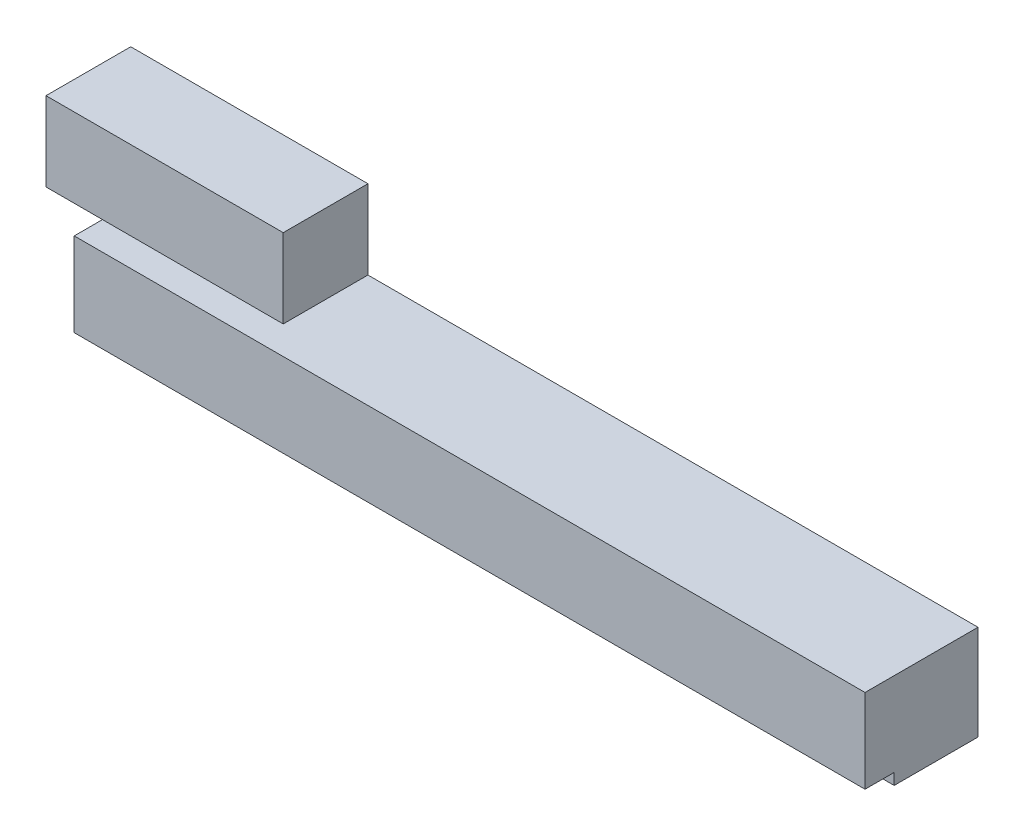
ISO-10303-21;
HEADER;
FILE_DESCRIPTION(('STEP AP214'),'2;1');
FILE_NAME('part.step','',(''),(''),'','','');
FILE_SCHEMA(('AUTOMOTIVE_DESIGN { 1 0 10303 214 1 1 1 1 }'));
ENDSEC;
DATA;
#1=APPLICATION_CONTEXT('core data for automotive mechanical design processes');
#2=APPLICATION_PROTOCOL_DEFINITION('international standard','automotive_design',2000,#1);
#3=PRODUCT_CONTEXT('',#1,'mechanical');
#4=PRODUCT('Part','Part','',(#3));
#5=PRODUCT_RELATED_PRODUCT_CATEGORY('part','',(#4));
#6=PRODUCT_DEFINITION_FORMATION('','',#4);
#7=PRODUCT_DEFINITION_CONTEXT('part definition',#1,'design');
#8=PRODUCT_DEFINITION('design','',#6,#7);
#9=PRODUCT_DEFINITION_SHAPE('','',#8);
#10=(LENGTH_UNIT() NAMED_UNIT(*) SI_UNIT(.MILLI.,.METRE.));
#11=(NAMED_UNIT(*) PLANE_ANGLE_UNIT() SI_UNIT($,.RADIAN.));
#12=(NAMED_UNIT(*) SI_UNIT($,.STERADIAN.) SOLID_ANGLE_UNIT());
#13=UNCERTAINTY_MEASURE_WITH_UNIT(LENGTH_MEASURE(1.E-05),#10,'distance_accuracy_value','');
#14=(GEOMETRIC_REPRESENTATION_CONTEXT(3) GLOBAL_UNCERTAINTY_ASSIGNED_CONTEXT((#13)) GLOBAL_UNIT_ASSIGNED_CONTEXT((#10,
#11,#12)) REPRESENTATION_CONTEXT('',''));
#15=CARTESIAN_POINT('',(0.,0.,0.));
#16=DIRECTION('',(0.,0.,1.));
#17=DIRECTION('',(1.,0.,0.));
#18=AXIS2_PLACEMENT_3D('',#15,#16,#17);
#19=CARTESIAN_POINT('',(140.,-6.41999999998371,0.));
#20=DIRECTION('',(0.,1.,0.));
#21=DIRECTION('',(0.,0.,1.));
#22=AXIS2_PLACEMENT_3D('',#19,#20,#21);
#23=PLANE('',#22);
#24=DIRECTION('',(0.,0.,-1.));
#25=VECTOR('',#24,1.);
#26=CARTESIAN_POINT('',(0.,-6.41999999998371,0.));
#27=LINE('',#26,#25);
#28=CARTESIAN_POINT('',(0.,-6.41999999998371,9.99999999999999));
#29=VERTEX_POINT('',#28);
#30=CARTESIAN_POINT('',(0.,-6.41999999998371,4.83999999998369));
#31=VERTEX_POINT('',#30);
#32=EDGE_CURVE('E150',#29,#31,#27,.T.);
#33=ORIENTED_EDGE('',*,*,#32,.T.);
#34=DIRECTION('',(-1.,0.,0.));
#35=VECTOR('',#34,1.);
#36=CARTESIAN_POINT('',(140.,-6.41999999998371,4.83999999998369));
#37=LINE('',#36,#35);
#38=CARTESIAN_POINT('',(140.,-6.41999999998371,4.83999999998369));
#39=VERTEX_POINT('',#38);
#40=EDGE_CURVE('E42',#39,#31,#37,.T.);
#41=ORIENTED_EDGE('',*,*,#40,.F.);
#42=DIRECTION('',(0.,0.,-1.));
#43=VECTOR('',#42,1.);
#44=CARTESIAN_POINT('',(140.,-6.41999999998371,0.));
#45=LINE('',#44,#43);
#46=CARTESIAN_POINT('',(140.,-6.41999999998371,9.99999999999999));
#47=VERTEX_POINT('',#46);
#48=EDGE_CURVE('E156',#47,#39,#45,.T.);
#49=ORIENTED_EDGE('',*,*,#48,.F.);
#50=DIRECTION('',(-1.,0.,0.));
#51=VECTOR('',#50,1.);
#52=CARTESIAN_POINT('',(140.,-6.41999999998371,9.99999999999999));
#53=LINE('',#52,#51);
#54=EDGE_CURVE('E168',#47,#29,#53,.T.);
#55=ORIENTED_EDGE('',*,*,#54,.T.);
#56=EDGE_LOOP('',(#33,#41,#49,#55));
#57=FACE_BOUND('',#56,.T.);
#58=ADVANCED_FACE('F41',(#57),#23,.F.);
#59=CARTESIAN_POINT('',(140.,0.,4.83999999998369));
#60=DIRECTION('',(0.,0.,-1.));
#61=DIRECTION('',(-1.,0.,0.));
#62=AXIS2_PLACEMENT_3D('',#59,#60,#61);
#63=PLANE('',#62);
#64=DIRECTION('',(0.,-1.,0.));
#65=VECTOR('',#64,1.);
#66=CARTESIAN_POINT('',(0.,0.,4.83999999998369));
#67=LINE('',#66,#65);
#68=CARTESIAN_POINT('',(0.,-8.42,4.83999999998369));
#69=VERTEX_POINT('',#68);
#70=EDGE_CURVE('E147',#31,#69,#67,.T.);
#71=ORIENTED_EDGE('',*,*,#70,.T.);
#72=DIRECTION('',(-1.,0.,0.));
#73=VECTOR('',#72,1.);
#74=CARTESIAN_POINT('',(140.,-8.42,4.83999999998369));
#75=LINE('',#74,#73);
#76=CARTESIAN_POINT('',(140.,-8.42,4.83999999998369));
#77=VERTEX_POINT('',#76);
#78=EDGE_CURVE('E188',#77,#69,#75,.T.);
#79=ORIENTED_EDGE('',*,*,#78,.F.);
#80=DIRECTION('',(0.,-1.,0.));
#81=VECTOR('',#80,1.);
#82=CARTESIAN_POINT('',(140.,0.,4.83999999998369));
#83=LINE('',#82,#81);
#84=EDGE_CURVE('E157',#39,#77,#83,.T.);
#85=ORIENTED_EDGE('',*,*,#84,.F.);
#86=ORIENTED_EDGE('',*,*,#40,.T.);
#87=EDGE_LOOP('',(#71,#79,#85,#86));
#88=FACE_BOUND('',#87,.T.);
#89=ADVANCED_FACE('F196',(#88),#63,.F.);
#90=CARTESIAN_POINT('',(140.,-8.42,0.));
#91=DIRECTION('',(0.,1.,0.));
#92=DIRECTION('',(0.,0.,1.));
#93=AXIS2_PLACEMENT_3D('',#90,#91,#92);
#94=PLANE('',#93);
#95=DIRECTION('',(0.,0.,-1.));
#96=VECTOR('',#95,1.);
#97=CARTESIAN_POINT('',(0.,-8.42,0.));
#98=LINE('',#97,#96);
#99=CARTESIAN_POINT('',(0.,-8.42,-10.));
#100=VERTEX_POINT('',#99);
#101=EDGE_CURVE('E172',#69,#100,#98,.T.);
#102=ORIENTED_EDGE('',*,*,#101,.T.);
#103=DIRECTION('',(-1.,0.,0.));
#104=VECTOR('',#103,1.);
#105=CARTESIAN_POINT('',(140.,-8.42,-10.));
#106=LINE('',#105,#104);
#107=CARTESIAN_POINT('',(140.,-8.42,-10.));
#108=VERTEX_POINT('',#107);
#109=EDGE_CURVE('E190',#108,#100,#106,.T.);
#110=ORIENTED_EDGE('',*,*,#109,.F.);
#111=DIRECTION('',(0.,0.,-1.));
#112=VECTOR('',#111,1.);
#113=CARTESIAN_POINT('',(140.,-8.42,0.));
#114=LINE('',#113,#112);
#115=EDGE_CURVE('E165',#77,#108,#114,.T.);
#116=ORIENTED_EDGE('',*,*,#115,.F.);
#117=ORIENTED_EDGE('',*,*,#78,.T.);
#118=EDGE_LOOP('',(#102,#110,#116,#117));
#119=FACE_BOUND('',#118,.T.);
#120=ADVANCED_FACE('F242',(#119),#94,.F.);
#121=CARTESIAN_POINT('',(140.,0.,-10.));
#122=DIRECTION('',(0.,0.,1.));
#123=DIRECTION('',(1.,0.,0.));
#124=AXIS2_PLACEMENT_3D('',#121,#122,#123);
#125=PLANE('',#124);
#126=DIRECTION('',(0.,1.,0.));
#127=VECTOR('',#126,1.);
#128=CARTESIAN_POINT('',(0.,0.,-10.));
#129=LINE('',#128,#127);
#130=CARTESIAN_POINT('',(0.,8.42,-10.));
#131=VERTEX_POINT('',#130);
#132=EDGE_CURVE('E174',#100,#131,#129,.T.);
#133=ORIENTED_EDGE('',*,*,#132,.T.);
#134=DIRECTION('',(-1.,0.,0.));
#135=VECTOR('',#134,1.);
#136=CARTESIAN_POINT('',(-9.99999999999999,8.42,-10.));
#137=LINE('',#136,#135);
#138=CARTESIAN_POINT('',(-9.99999999999999,8.42,-10.));
#139=VERTEX_POINT('',#138);
#140=EDGE_CURVE('E142',#131,#139,#137,.T.);
#141=ORIENTED_EDGE('',*,*,#140,.T.);
#142=DIRECTION('',(0.,-1.,0.));
#143=VECTOR('',#142,1.);
#144=CARTESIAN_POINT('',(-9.99999999999999,22.42,-10.));
#145=LINE('',#144,#143);
#146=CARTESIAN_POINT('',(-9.99999999999999,22.42,-10.));
#147=VERTEX_POINT('',#146);
#148=EDGE_CURVE('E222',#147,#139,#145,.T.);
#149=ORIENTED_EDGE('',*,*,#148,.F.);
#150=DIRECTION('',(-1.,0.,0.));
#151=VECTOR('',#150,1.);
#152=CARTESIAN_POINT('',(-9.99999999999999,22.42,-10.));
#153=LINE('',#152,#151);
#154=CARTESIAN_POINT('',(32.,22.42,-10.));
#155=VERTEX_POINT('',#154);
#156=EDGE_CURVE('E140',#155,#147,#153,.T.);
#157=ORIENTED_EDGE('',*,*,#156,.F.);
#158=DIRECTION('',(0.,-1.,0.));
#159=VECTOR('',#158,1.);
#160=CARTESIAN_POINT('',(32.,22.42,-10.));
#161=LINE('',#160,#159);
#162=CARTESIAN_POINT('',(32.,8.42,-10.));
#163=VERTEX_POINT('',#162);
#164=EDGE_CURVE('E155',#155,#163,#161,.T.);
#165=ORIENTED_EDGE('',*,*,#164,.T.);
#166=DIRECTION('',(-1.,0.,0.));
#167=VECTOR('',#166,1.);
#168=CARTESIAN_POINT('',(140.,8.42,-10.));
#169=LINE('',#168,#167);
#170=CARTESIAN_POINT('',(140.,8.42,-10.));
#171=VERTEX_POINT('',#170);
#172=EDGE_CURVE('E60',#171,#163,#169,.T.);
#173=ORIENTED_EDGE('',*,*,#172,.F.);
#174=DIRECTION('',(0.,1.,0.));
#175=VECTOR('',#174,1.);
#176=CARTESIAN_POINT('',(140.,0.,-10.));
#177=LINE('',#176,#175);
#178=EDGE_CURVE('E163',#108,#171,#177,.T.);
#179=ORIENTED_EDGE('',*,*,#178,.F.);
#180=ORIENTED_EDGE('',*,*,#109,.T.);
#181=EDGE_LOOP('',(#133,#141,#149,#157,#165,#173,#179,#180));
#182=FACE_BOUND('',#181,.T.);
#183=ADVANCED_FACE('F223',(#182),#125,.F.);
#184=CARTESIAN_POINT('',(140.,8.42,0.));
#185=DIRECTION('',(0.,1.,0.));
#186=DIRECTION('',(0.,0.,1.));
#187=AXIS2_PLACEMENT_3D('',#184,#185,#186);
#188=PLANE('',#187);
#189=DIRECTION('',(0.,0.,-1.));
#190=VECTOR('',#189,1.);
#191=CARTESIAN_POINT('',(32.,8.42,-10.));
#192=LINE('',#191,#190);
#193=CARTESIAN_POINT('',(32.,8.42,5.));
#194=VERTEX_POINT('',#193);
#195=EDGE_CURVE('E214',#194,#163,#192,.T.);
#196=ORIENTED_EDGE('',*,*,#195,.F.);
#197=DIRECTION('',(1.,0.,0.));
#198=VECTOR('',#197,1.);
#199=CARTESIAN_POINT('',(-9.99999999999999,8.42,5.));
#200=LINE('',#199,#198);
#201=CARTESIAN_POINT('',(0.,8.42,5.));
#202=VERTEX_POINT('',#201);
#203=EDGE_CURVE('E11',#202,#194,#200,.T.);
#204=ORIENTED_EDGE('',*,*,#203,.F.);
#205=DIRECTION('',(0.,0.,-1.));
#206=VECTOR('',#205,1.);
#207=CARTESIAN_POINT('',(0.,8.42,0.));
#208=LINE('',#207,#206);
#209=CARTESIAN_POINT('',(0.,8.42,9.99999999999999));
#210=VERTEX_POINT('',#209);
#211=EDGE_CURVE('E178',#210,#202,#208,.T.);
#212=ORIENTED_EDGE('',*,*,#211,.F.);
#213=DIRECTION('',(-1.,0.,0.));
#214=VECTOR('',#213,1.);
#215=CARTESIAN_POINT('',(140.,8.42,9.99999999999999));
#216=LINE('',#215,#214);
#217=CARTESIAN_POINT('',(140.,8.42,9.99999999999999));
#218=VERTEX_POINT('',#217);
#219=EDGE_CURVE('E184',#218,#210,#216,.T.);
#220=ORIENTED_EDGE('',*,*,#219,.F.);
#221=DIRECTION('',(0.,0.,-1.));
#222=VECTOR('',#221,1.);
#223=CARTESIAN_POINT('',(140.,8.42,0.));
#224=LINE('',#223,#222);
#225=EDGE_CURVE('E167',#218,#171,#224,.T.);
#226=ORIENTED_EDGE('',*,*,#225,.T.);
#227=ORIENTED_EDGE('',*,*,#172,.T.);
#228=EDGE_LOOP('',(#196,#204,#212,#220,#226,#227));
#229=FACE_BOUND('',#228,.T.);
#230=ADVANCED_FACE('F207',(#229),#188,.T.);
#231=CARTESIAN_POINT('',(140.,0.,9.99999999999999));
#232=DIRECTION('',(0.,0.,1.));
#233=DIRECTION('',(1.,0.,0.));
#234=AXIS2_PLACEMENT_3D('',#231,#232,#233);
#235=PLANE('',#234);
#236=DIRECTION('',(0.,1.,0.));
#237=VECTOR('',#236,1.);
#238=CARTESIAN_POINT('',(0.,0.,9.99999999999999));
#239=LINE('',#238,#237);
#240=EDGE_CURVE('E159',#29,#210,#239,.T.);
#241=ORIENTED_EDGE('',*,*,#240,.F.);
#242=ORIENTED_EDGE('',*,*,#54,.F.);
#243=DIRECTION('',(0.,1.,0.));
#244=VECTOR('',#243,1.);
#245=CARTESIAN_POINT('',(140.,0.,9.99999999999999));
#246=LINE('',#245,#244);
#247=EDGE_CURVE('E169',#47,#218,#246,.T.);
#248=ORIENTED_EDGE('',*,*,#247,.T.);
#249=ORIENTED_EDGE('',*,*,#219,.T.);
#250=EDGE_LOOP('',(#241,#242,#248,#249));
#251=FACE_BOUND('',#250,.T.);
#252=ADVANCED_FACE('F206',(#251),#235,.T.);
#253=CARTESIAN_POINT('',(140.,0.,0.));
#254=DIRECTION('',(1.,0.,0.));
#255=DIRECTION('',(0.,0.,-1.));
#256=AXIS2_PLACEMENT_3D('',#253,#254,#255);
#257=PLANE('',#256);
#258=ORIENTED_EDGE('',*,*,#48,.T.);
#259=ORIENTED_EDGE('',*,*,#84,.T.);
#260=ORIENTED_EDGE('',*,*,#115,.T.);
#261=ORIENTED_EDGE('',*,*,#178,.T.);
#262=ORIENTED_EDGE('',*,*,#225,.F.);
#263=ORIENTED_EDGE('',*,*,#247,.F.);
#264=EDGE_LOOP('',(#258,#259,#260,#261,#262,#263));
#265=FACE_BOUND('',#264,.T.);
#266=ADVANCED_FACE('F254',(#265),#257,.T.);
#267=CARTESIAN_POINT('',(0.,0.,0.));
#268=DIRECTION('',(1.,0.,0.));
#269=DIRECTION('',(0.,0.,-1.));
#270=AXIS2_PLACEMENT_3D('',#267,#268,#269);
#271=PLANE('',#270);
#272=ORIENTED_EDGE('',*,*,#32,.F.);
#273=ORIENTED_EDGE('',*,*,#240,.T.);
#274=ORIENTED_EDGE('',*,*,#211,.T.);
#275=EDGE_CURVE('E180',#202,#131,#208,.T.);
#276=ORIENTED_EDGE('',*,*,#275,.T.);
#277=ORIENTED_EDGE('',*,*,#132,.F.);
#278=ORIENTED_EDGE('',*,*,#101,.F.);
#279=ORIENTED_EDGE('',*,*,#70,.F.);
#280=EDGE_LOOP('',(#272,#273,#274,#276,#277,#278,#279));
#281=FACE_BOUND('',#280,.T.);
#282=ADVANCED_FACE('F204',(#281),#271,.F.);
#283=CARTESIAN_POINT('',(-9.99999999999999,22.42,-10.));
#284=DIRECTION('',(1.,0.,0.));
#285=DIRECTION('',(0.,0.,-1.));
#286=AXIS2_PLACEMENT_3D('',#283,#284,#285);
#287=PLANE('',#286);
#288=DIRECTION('',(0.,0.,1.));
#289=VECTOR('',#288,1.);
#290=CARTESIAN_POINT('',(-9.99999999999999,8.42,-10.));
#291=LINE('',#290,#289);
#292=CARTESIAN_POINT('',(-9.99999999999999,8.42,5.));
#293=VERTEX_POINT('',#292);
#294=EDGE_CURVE('E148',#139,#293,#291,.T.);
#295=ORIENTED_EDGE('',*,*,#294,.T.);
#296=DIRECTION('',(0.,-1.,0.));
#297=VECTOR('',#296,1.);
#298=CARTESIAN_POINT('',(-9.99999999999999,22.42,5.));
#299=LINE('',#298,#297);
#300=CARTESIAN_POINT('',(-9.99999999999999,22.42,5.));
#301=VERTEX_POINT('',#300);
#302=EDGE_CURVE('E127',#301,#293,#299,.T.);
#303=ORIENTED_EDGE('',*,*,#302,.F.);
#304=DIRECTION('',(0.,0.,1.));
#305=VECTOR('',#304,1.);
#306=CARTESIAN_POINT('',(-9.99999999999999,22.42,-10.));
#307=LINE('',#306,#305);
#308=EDGE_CURVE('E132',#147,#301,#307,.T.);
#309=ORIENTED_EDGE('',*,*,#308,.F.);
#310=ORIENTED_EDGE('',*,*,#148,.T.);
#311=EDGE_LOOP('',(#295,#303,#309,#310));
#312=FACE_BOUND('',#311,.T.);
#313=ADVANCED_FACE('F145',(#312),#287,.F.);
#314=CARTESIAN_POINT('',(-9.99999999999999,22.42,5.));
#315=DIRECTION('',(0.,0.,-1.));
#316=DIRECTION('',(-1.,0.,0.));
#317=AXIS2_PLACEMENT_3D('',#314,#315,#316);
#318=PLANE('',#317);
#319=EDGE_CURVE('E49',#293,#202,#200,.T.);
#320=ORIENTED_EDGE('',*,*,#319,.T.);
#321=ORIENTED_EDGE('',*,*,#203,.T.);
#322=DIRECTION('',(0.,-1.,0.));
#323=VECTOR('',#322,1.);
#324=CARTESIAN_POINT('',(32.,22.42,5.));
#325=LINE('',#324,#323);
#326=CARTESIAN_POINT('',(32.,22.42,5.));
#327=VERTEX_POINT('',#326);
#328=EDGE_CURVE('E129',#327,#194,#325,.T.);
#329=ORIENTED_EDGE('',*,*,#328,.F.);
#330=DIRECTION('',(1.,0.,0.));
#331=VECTOR('',#330,1.);
#332=CARTESIAN_POINT('',(-9.99999999999999,22.42,5.));
#333=LINE('',#332,#331);
#334=EDGE_CURVE('E124',#301,#327,#333,.T.);
#335=ORIENTED_EDGE('',*,*,#334,.F.);
#336=ORIENTED_EDGE('',*,*,#302,.T.);
#337=EDGE_LOOP('',(#320,#321,#329,#335,#336));
#338=FACE_BOUND('',#337,.T.);
#339=ADVANCED_FACE('F123',(#338),#318,.F.);
#340=CARTESIAN_POINT('',(32.,22.42,-10.));
#341=DIRECTION('',(-1.,0.,0.));
#342=DIRECTION('',(0.,0.,1.));
#343=AXIS2_PLACEMENT_3D('',#340,#341,#342);
#344=PLANE('',#343);
#345=ORIENTED_EDGE('',*,*,#195,.T.);
#346=ORIENTED_EDGE('',*,*,#164,.F.);
#347=DIRECTION('',(0.,0.,-1.));
#348=VECTOR('',#347,1.);
#349=CARTESIAN_POINT('',(32.,22.42,-10.));
#350=LINE('',#349,#348);
#351=EDGE_CURVE('E135',#327,#155,#350,.T.);
#352=ORIENTED_EDGE('',*,*,#351,.F.);
#353=ORIENTED_EDGE('',*,*,#328,.T.);
#354=EDGE_LOOP('',(#345,#346,#352,#353));
#355=FACE_BOUND('',#354,.T.);
#356=ADVANCED_FACE('F227',(#355),#344,.F.);
#357=CARTESIAN_POINT('',(0.,22.42,0.));
#358=DIRECTION('',(0.,1.,0.));
#359=DIRECTION('',(0.,0.,1.));
#360=AXIS2_PLACEMENT_3D('',#357,#358,#359);
#361=PLANE('',#360);
#362=ORIENTED_EDGE('',*,*,#308,.T.);
#363=ORIENTED_EDGE('',*,*,#334,.T.);
#364=ORIENTED_EDGE('',*,*,#351,.T.);
#365=ORIENTED_EDGE('',*,*,#156,.T.);
#366=EDGE_LOOP('',(#362,#363,#364,#365));
#367=FACE_BOUND('',#366,.T.);
#368=ADVANCED_FACE('F139',(#367),#361,.T.);
#369=CARTESIAN_POINT('',(0.,8.42,0.));
#370=DIRECTION('',(0.,1.,0.));
#371=DIRECTION('',(0.,0.,1.));
#372=AXIS2_PLACEMENT_3D('',#369,#370,#371);
#373=PLANE('',#372);
#374=ORIENTED_EDGE('',*,*,#275,.F.);
#375=ORIENTED_EDGE('',*,*,#319,.F.);
#376=ORIENTED_EDGE('',*,*,#294,.F.);
#377=ORIENTED_EDGE('',*,*,#140,.F.);
#378=EDGE_LOOP('',(#374,#375,#376,#377));
#379=FACE_BOUND('',#378,.T.);
#380=ADVANCED_FACE('F212',(#379),#373,.F.);
#381=CLOSED_SHELL('',(#58,#89,#120,#183,#230,#252,#266,#282,#313,#339,#356,#368,#380));
#382=MANIFOLD_SOLID_BREP('B2',#381);
#383=ADVANCED_BREP_SHAPE_REPRESENTATION('',(#18,#382),#14);
#384=SHAPE_DEFINITION_REPRESENTATION(#9,#383);
ENDSEC;
END-ISO-10303-21;
